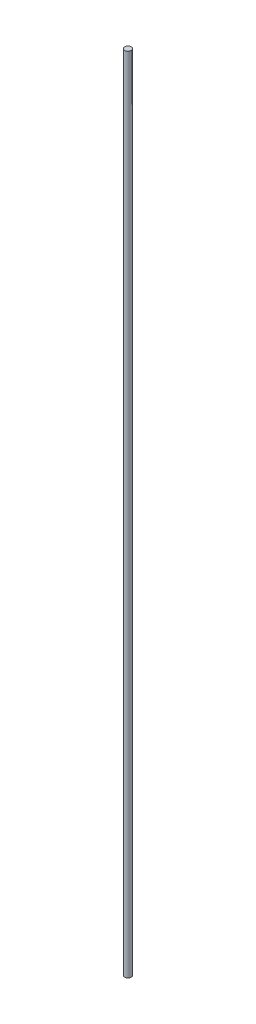
ISO-10303-21;
HEADER;
FILE_DESCRIPTION(('STEP AP214'),'2;1');
FILE_NAME('part.step','',(''),(''),'','','');
FILE_SCHEMA(('AUTOMOTIVE_DESIGN { 1 0 10303 214 1 1 1 1 }'));
ENDSEC;
DATA;
#1=APPLICATION_CONTEXT('core data for automotive mechanical design processes');
#2=APPLICATION_PROTOCOL_DEFINITION('international standard','automotive_design',2000,#1);
#3=PRODUCT_CONTEXT('',#1,'mechanical');
#4=PRODUCT('Part','Part','',(#3));
#5=PRODUCT_RELATED_PRODUCT_CATEGORY('part','',(#4));
#6=PRODUCT_DEFINITION_FORMATION('','',#4);
#7=PRODUCT_DEFINITION_CONTEXT('part definition',#1,'design');
#8=PRODUCT_DEFINITION('design','',#6,#7);
#9=PRODUCT_DEFINITION_SHAPE('','',#8);
#10=(LENGTH_UNIT() NAMED_UNIT(*) SI_UNIT(.MILLI.,.METRE.));
#11=(NAMED_UNIT(*) PLANE_ANGLE_UNIT() SI_UNIT($,.RADIAN.));
#12=(NAMED_UNIT(*) SI_UNIT($,.STERADIAN.) SOLID_ANGLE_UNIT());
#13=UNCERTAINTY_MEASURE_WITH_UNIT(LENGTH_MEASURE(1.E-05),#10,'distance_accuracy_value','');
#14=(GEOMETRIC_REPRESENTATION_CONTEXT(3) GLOBAL_UNCERTAINTY_ASSIGNED_CONTEXT((#13)) GLOBAL_UNIT_ASSIGNED_CONTEXT((#10,
#11,#12)) REPRESENTATION_CONTEXT('',''));
#15=CARTESIAN_POINT('',(0.,0.,0.));
#16=DIRECTION('',(0.,0.,1.));
#17=DIRECTION('',(1.,0.,0.));
#18=AXIS2_PLACEMENT_3D('',#15,#16,#17);
#19=CARTESIAN_POINT('',(0.,787.4,0.));
#20=DIRECTION('',(0.,-1.,0.));
#21=DIRECTION('',(0.,0.,-1.));
#22=AXIS2_PLACEMENT_3D('',#19,#20,#21);
#23=CYLINDRICAL_SURFACE('',#22,3.175);
#24=CARTESIAN_POINT('',(0.,787.4,0.));
#25=DIRECTION('',(0.,1.,0.));
#26=DIRECTION('',(0.,0.,1.));
#27=AXIS2_PLACEMENT_3D('',#24,#25,#26);
#28=CIRCLE('',#27,3.175);
#29=CARTESIAN_POINT('',(0.,787.4,3.175));
#30=VERTEX_POINT('',#29);
#31=EDGE_CURVE('E10',#30,#30,#28,.T.);
#32=ORIENTED_EDGE('',*,*,#31,.F.);
#33=EDGE_LOOP('',(#32));
#34=FACE_BOUND('',#33,.T.);
#35=CARTESIAN_POINT('',(0.,0.,0.));
#36=DIRECTION('',(0.,1.,0.));
#37=DIRECTION('',(0.,0.,1.));
#38=AXIS2_PLACEMENT_3D('',#35,#36,#37);
#39=CIRCLE('',#38,3.175);
#40=CARTESIAN_POINT('',(0.,0.,3.175));
#41=VERTEX_POINT('',#40);
#42=EDGE_CURVE('E34',#41,#41,#39,.T.);
#43=ORIENTED_EDGE('',*,*,#42,.T.);
#44=EDGE_LOOP('',(#43));
#45=FACE_BOUND('',#44,.T.);
#46=ADVANCED_FACE('F31',(#34,#45),#23,.T.);
#47=CARTESIAN_POINT('',(0.,787.4,0.));
#48=DIRECTION('',(0.,1.,0.));
#49=DIRECTION('',(0.,0.,1.));
#50=AXIS2_PLACEMENT_3D('',#47,#48,#49);
#51=PLANE('',#50);
#52=ORIENTED_EDGE('',*,*,#31,.T.);
#53=EDGE_LOOP('',(#52));
#54=FACE_BOUND('',#53,.T.);
#55=ADVANCED_FACE('F46',(#54),#51,.T.);
#56=CARTESIAN_POINT('',(0.,0.,0.));
#57=DIRECTION('',(0.,1.,0.));
#58=DIRECTION('',(0.,0.,1.));
#59=AXIS2_PLACEMENT_3D('',#56,#57,#58);
#60=PLANE('',#59);
#61=ORIENTED_EDGE('',*,*,#42,.F.);
#62=EDGE_LOOP('',(#61));
#63=FACE_BOUND('',#62,.T.);
#64=ADVANCED_FACE('F44',(#63),#60,.F.);
#65=CLOSED_SHELL('',(#46,#55,#64));
#66=MANIFOLD_SOLID_BREP('B2',#65);
#67=ADVANCED_BREP_SHAPE_REPRESENTATION('',(#18,#66),#14);
#68=SHAPE_DEFINITION_REPRESENTATION(#9,#67);
ENDSEC;
END-ISO-10303-21;
